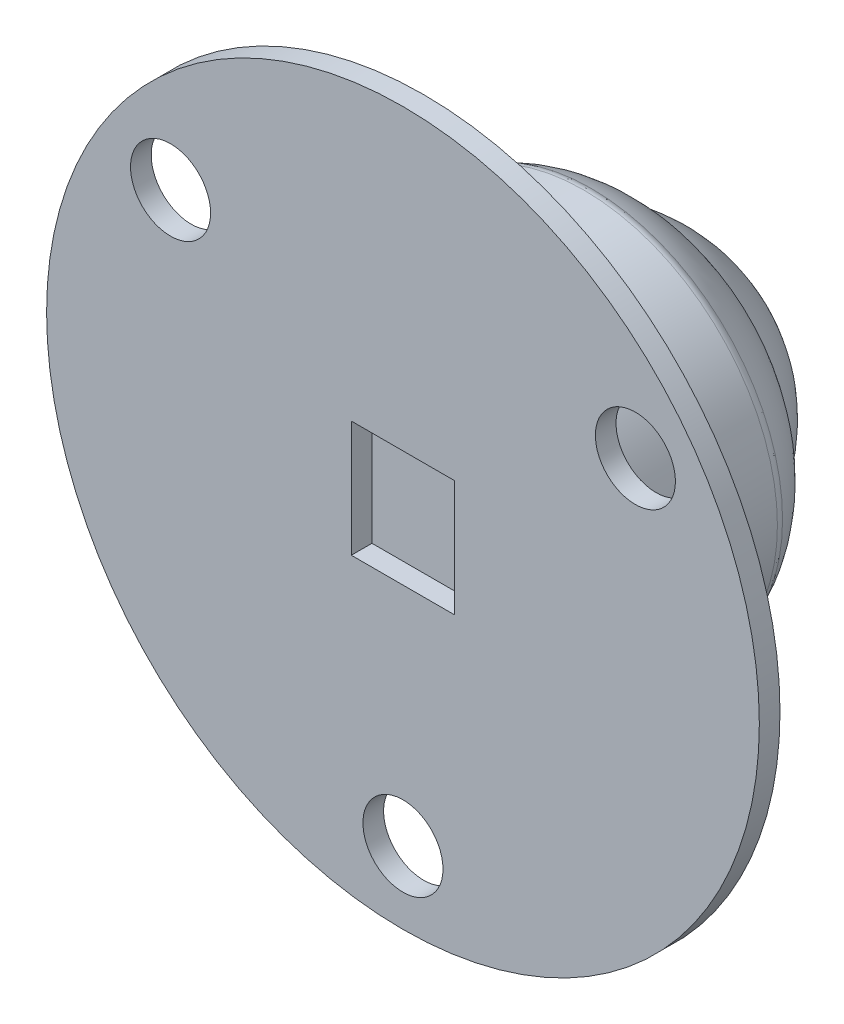
ISO-10303-21;
HEADER;
FILE_DESCRIPTION(('STEP AP214'),'2;1');
FILE_NAME('part.step','',(''),(''),'','','');
FILE_SCHEMA(('AUTOMOTIVE_DESIGN { 1 0 10303 214 1 1 1 1 }'));
ENDSEC;
DATA;
#1=APPLICATION_CONTEXT('core data for automotive mechanical design processes');
#2=APPLICATION_PROTOCOL_DEFINITION('international standard','automotive_design',2000,#1);
#3=PRODUCT_CONTEXT('',#1,'mechanical');
#4=PRODUCT('Part','Part','',(#3));
#5=PRODUCT_RELATED_PRODUCT_CATEGORY('part','',(#4));
#6=PRODUCT_DEFINITION_FORMATION('','',#4);
#7=PRODUCT_DEFINITION_CONTEXT('part definition',#1,'design');
#8=PRODUCT_DEFINITION('design','',#6,#7);
#9=PRODUCT_DEFINITION_SHAPE('','',#8);
#10=(LENGTH_UNIT() NAMED_UNIT(*) SI_UNIT(.MILLI.,.METRE.));
#11=(NAMED_UNIT(*) PLANE_ANGLE_UNIT() SI_UNIT($,.RADIAN.));
#12=(NAMED_UNIT(*) SI_UNIT($,.STERADIAN.) SOLID_ANGLE_UNIT());
#13=UNCERTAINTY_MEASURE_WITH_UNIT(LENGTH_MEASURE(1.E-05),#10,'distance_accuracy_value','');
#14=(GEOMETRIC_REPRESENTATION_CONTEXT(3) GLOBAL_UNCERTAINTY_ASSIGNED_CONTEXT((#13)) GLOBAL_UNIT_ASSIGNED_CONTEXT((#10,
#11,#12)) REPRESENTATION_CONTEXT('',''));
#15=CARTESIAN_POINT('',(0.,0.,0.));
#16=DIRECTION('',(0.,0.,1.));
#17=DIRECTION('',(1.,0.,0.));
#18=AXIS2_PLACEMENT_3D('',#15,#16,#17);
#19=CARTESIAN_POINT('',(0.,0.,0.8));
#20=DIRECTION('',(0.,0.,-1.));
#21=DIRECTION('',(-1.,0.,0.));
#22=AXIS2_PLACEMENT_3D('',#19,#20,#21);
#23=CYLINDRICAL_SURFACE('',#22,13.8);
#24=CARTESIAN_POINT('',(0.,0.,0.8));
#25=DIRECTION('',(0.,0.,1.));
#26=DIRECTION('',(1.,0.,0.));
#27=AXIS2_PLACEMENT_3D('',#24,#25,#26);
#28=CIRCLE('',#27,13.8);
#29=CARTESIAN_POINT('',(13.8,0.,0.8));
#30=VERTEX_POINT('',#29);
#31=EDGE_CURVE('E181',#30,#30,#28,.T.);
#32=ORIENTED_EDGE('',*,*,#31,.F.);
#33=EDGE_LOOP('',(#32));
#34=FACE_BOUND('',#33,.T.);
#35=CARTESIAN_POINT('',(0.,0.,0.));
#36=DIRECTION('',(0.,0.,1.));
#37=DIRECTION('',(1.,0.,0.));
#38=AXIS2_PLACEMENT_3D('',#35,#36,#37);
#39=CIRCLE('',#38,13.8);
#40=CARTESIAN_POINT('',(13.8,0.,0.));
#41=VERTEX_POINT('',#40);
#42=EDGE_CURVE('E179',#41,#41,#39,.T.);
#43=ORIENTED_EDGE('',*,*,#42,.T.);
#44=EDGE_LOOP('',(#43));
#45=FACE_BOUND('',#44,.T.);
#46=ADVANCED_FACE('F33',(#34,#45),#23,.T.);
#47=CARTESIAN_POINT('',(0.,0.,0.8));
#48=DIRECTION('',(0.,0.,1.));
#49=DIRECTION('',(1.,0.,0.));
#50=AXIS2_PLACEMENT_3D('',#47,#48,#49);
#51=PLANE('',#50);
#52=DIRECTION('',(0.,1.,0.));
#53=VECTOR('',#52,1.);
#54=CARTESIAN_POINT('',(2.,-2.25,0.8));
#55=LINE('',#54,#53);
#56=CARTESIAN_POINT('',(2.,-2.25,0.8));
#57=VERTEX_POINT('',#56);
#58=CARTESIAN_POINT('',(2.,2.25,0.8));
#59=VERTEX_POINT('',#58);
#60=EDGE_CURVE('E146',#57,#59,#55,.T.);
#61=ORIENTED_EDGE('',*,*,#60,.F.);
#62=DIRECTION('',(1.,0.,0.));
#63=VECTOR('',#62,1.);
#64=CARTESIAN_POINT('',(-2.,-2.25,0.8));
#65=LINE('',#64,#63);
#66=CARTESIAN_POINT('',(-2.,-2.25,0.8));
#67=VERTEX_POINT('',#66);
#68=EDGE_CURVE('E153',#67,#57,#65,.T.);
#69=ORIENTED_EDGE('',*,*,#68,.F.);
#70=DIRECTION('',(0.,-1.,0.));
#71=VECTOR('',#70,1.);
#72=CARTESIAN_POINT('',(-2.,-2.25,0.8));
#73=LINE('',#72,#71);
#74=CARTESIAN_POINT('',(-2.,2.25,0.8));
#75=VERTEX_POINT('',#74);
#76=EDGE_CURVE('E150',#75,#67,#73,.T.);
#77=ORIENTED_EDGE('',*,*,#76,.F.);
#78=DIRECTION('',(-1.,0.,0.));
#79=VECTOR('',#78,1.);
#80=CARTESIAN_POINT('',(-2.,2.25,0.8));
#81=LINE('',#80,#79);
#82=EDGE_CURVE('E148',#59,#75,#81,.T.);
#83=ORIENTED_EDGE('',*,*,#82,.F.);
#84=EDGE_LOOP('',(#61,#69,#77,#83));
#85=FACE_BOUND('',#84,.T.);
#86=CARTESIAN_POINT('',(0.,-11.,0.8));
#87=DIRECTION('',(0.,0.,1.));
#88=DIRECTION('',(1.,0.,0.));
#89=AXIS2_PLACEMENT_3D('',#86,#87,#88);
#90=CIRCLE('',#89,1.55);
#91=CARTESIAN_POINT('',(1.55,-11.,0.8));
#92=VERTEX_POINT('',#91);
#93=EDGE_CURVE('E164',#92,#92,#90,.F.);
#94=ORIENTED_EDGE('',*,*,#93,.T.);
#95=EDGE_LOOP('',(#94));
#96=FACE_BOUND('',#95,.T.);
#97=CARTESIAN_POINT('',(9.,6.5,0.8));
#98=DIRECTION('',(0.,0.,1.));
#99=DIRECTION('',(1.,0.,0.));
#100=AXIS2_PLACEMENT_3D('',#97,#98,#99);
#101=CIRCLE('',#100,1.55);
#102=CARTESIAN_POINT('',(10.55,6.5,0.8));
#103=VERTEX_POINT('',#102);
#104=EDGE_CURVE('E168',#103,#103,#101,.F.);
#105=ORIENTED_EDGE('',*,*,#104,.T.);
#106=EDGE_LOOP('',(#105));
#107=FACE_BOUND('',#106,.T.);
#108=CARTESIAN_POINT('',(-9.,6.5,0.8));
#109=DIRECTION('',(0.,0.,1.));
#110=DIRECTION('',(1.,0.,0.));
#111=AXIS2_PLACEMENT_3D('',#108,#109,#110);
#112=CIRCLE('',#111,1.55);
#113=CARTESIAN_POINT('',(-7.45,6.5,0.8));
#114=VERTEX_POINT('',#113);
#115=EDGE_CURVE('E172',#114,#114,#112,.F.);
#116=ORIENTED_EDGE('',*,*,#115,.T.);
#117=EDGE_LOOP('',(#116));
#118=FACE_BOUND('',#117,.T.);
#119=ORIENTED_EDGE('',*,*,#31,.T.);
#120=EDGE_LOOP('',(#119));
#121=FACE_BOUND('',#120,.T.);
#122=ADVANCED_FACE('F210',(#85,#96,#107,#118,#121),#51,.T.);
#123=CARTESIAN_POINT('',(0.,0.,0.));
#124=DIRECTION('',(0.,0.,1.));
#125=DIRECTION('',(1.,0.,0.));
#126=AXIS2_PLACEMENT_3D('',#123,#124,#125);
#127=PLANE('',#126);
#128=CARTESIAN_POINT('',(0.,-11.,0.));
#129=DIRECTION('',(0.,0.,1.));
#130=DIRECTION('',(1.,0.,0.));
#131=AXIS2_PLACEMENT_3D('',#128,#129,#130);
#132=CIRCLE('',#131,1.55);
#133=CARTESIAN_POINT('',(1.55,-11.,0.));
#134=VERTEX_POINT('',#133);
#135=EDGE_CURVE('E158',#134,#134,#132,.F.);
#136=ORIENTED_EDGE('',*,*,#135,.F.);
#137=EDGE_LOOP('',(#136));
#138=FACE_BOUND('',#137,.T.);
#139=CARTESIAN_POINT('',(9.,6.5,0.));
#140=DIRECTION('',(0.,0.,1.));
#141=DIRECTION('',(1.,0.,0.));
#142=AXIS2_PLACEMENT_3D('',#139,#140,#141);
#143=CIRCLE('',#142,1.55);
#144=CARTESIAN_POINT('',(10.55,6.5,0.));
#145=VERTEX_POINT('',#144);
#146=EDGE_CURVE('E167',#145,#145,#143,.F.);
#147=ORIENTED_EDGE('',*,*,#146,.F.);
#148=EDGE_LOOP('',(#147));
#149=FACE_BOUND('',#148,.T.);
#150=CARTESIAN_POINT('',(-9.,6.5,0.));
#151=DIRECTION('',(0.,0.,1.));
#152=DIRECTION('',(1.,0.,0.));
#153=AXIS2_PLACEMENT_3D('',#150,#151,#152);
#154=CIRCLE('',#153,1.55);
#155=CARTESIAN_POINT('',(-7.45,6.5,0.));
#156=VERTEX_POINT('',#155);
#157=EDGE_CURVE('E171',#156,#156,#154,.F.);
#158=ORIENTED_EDGE('',*,*,#157,.F.);
#159=EDGE_LOOP('',(#158));
#160=FACE_BOUND('',#159,.T.);
#161=CARTESIAN_POINT('',(0.,0.,0.));
#162=DIRECTION('',(0.,0.,1.));
#163=DIRECTION('',(1.,0.,0.));
#164=AXIS2_PLACEMENT_3D('',#161,#162,#163);
#165=CIRCLE('',#164,8.);
#166=CARTESIAN_POINT('',(8.,0.,0.));
#167=VERTEX_POINT('',#166);
#168=EDGE_CURVE('E41',#167,#167,#165,.T.);
#169=ORIENTED_EDGE('',*,*,#168,.T.);
#170=EDGE_LOOP('',(#169));
#171=FACE_BOUND('',#170,.T.);
#172=ORIENTED_EDGE('',*,*,#42,.F.);
#173=EDGE_LOOP('',(#172));
#174=FACE_BOUND('',#173,.T.);
#175=ADVANCED_FACE('F206',(#138,#149,#160,#171,#174),#127,.F.);
#176=CARTESIAN_POINT('',(0.,0.,-6.5));
#177=DIRECTION('',(0.,0.,1.));
#178=DIRECTION('',(1.,0.,0.));
#179=AXIS2_PLACEMENT_3D('',#176,#177,#178);
#180=CYLINDRICAL_SURFACE('',#179,7.5);
#181=CARTESIAN_POINT('',(0.,0.,-0.5));
#182=DIRECTION('',(0.,0.,1.));
#183=DIRECTION('',(1.,0.,0.));
#184=AXIS2_PLACEMENT_3D('',#181,#182,#183);
#185=CIRCLE('',#184,7.5);
#186=CARTESIAN_POINT('',(7.5,0.,-0.5));
#187=VERTEX_POINT('',#186);
#188=EDGE_CURVE('E191',#187,#187,#185,.F.);
#189=CARTESIAN_POINT('',(0.,0.,-6.2));
#190=DIRECTION('',(0.,0.,-1.));
#191=DIRECTION('',(-1.,0.,0.));
#192=AXIS2_PLACEMENT_3D('',#189,#190,#191);
#193=CIRCLE('',#192,7.5);
#194=CARTESIAN_POINT('',(7.5,0.,-6.2));
#195=VERTEX_POINT('',#194);
#196=EDGE_CURVE('E184',#195,#195,#193,.F.);
#197=CARTESIAN_POINT('',(7.5,0.,-0.5));
#198=CARTESIAN_POINT('',(7.5,0.,-0.559375000000001));
#199=CARTESIAN_POINT('',(7.5,0.,-0.618750000000001));
#200=CARTESIAN_POINT('',(7.5,0.,-0.737500000000001));
#201=CARTESIAN_POINT('',(7.5,0.,-0.796875000000001));
#202=CARTESIAN_POINT('',(7.5,0.,-0.915625000000001));
#203=CARTESIAN_POINT('',(7.5,0.,-0.975000000000001));
#204=CARTESIAN_POINT('',(7.5,0.,-1.09375));
#205=CARTESIAN_POINT('',(7.5,0.,-1.153125));
#206=CARTESIAN_POINT('',(7.5,0.,-1.271875));
#207=CARTESIAN_POINT('',(7.5,0.,-1.33125));
#208=CARTESIAN_POINT('',(7.5,0.,-1.45));
#209=CARTESIAN_POINT('',(7.5,0.,-1.509375));
#210=CARTESIAN_POINT('',(7.5,0.,-1.628125));
#211=CARTESIAN_POINT('',(7.5,0.,-1.6875));
#212=CARTESIAN_POINT('',(7.5,0.,-1.80625));
#213=CARTESIAN_POINT('',(7.5,0.,-1.865625));
#214=CARTESIAN_POINT('',(7.5,0.,-1.984375));
#215=CARTESIAN_POINT('',(7.5,0.,-2.04375));
#216=CARTESIAN_POINT('',(7.5,0.,-2.1625));
#217=CARTESIAN_POINT('',(7.5,0.,-2.221875));
#218=CARTESIAN_POINT('',(7.5,0.,-2.340625));
#219=CARTESIAN_POINT('',(7.5,0.,-2.4));
#220=CARTESIAN_POINT('',(7.5,0.,-2.51875));
#221=CARTESIAN_POINT('',(7.5,0.,-2.578125));
#222=CARTESIAN_POINT('',(7.5,0.,-2.696875));
#223=CARTESIAN_POINT('',(7.5,0.,-2.75625));
#224=CARTESIAN_POINT('',(7.5,0.,-2.875));
#225=CARTESIAN_POINT('',(7.5,0.,-2.934375));
#226=CARTESIAN_POINT('',(7.5,0.,-3.053125));
#227=CARTESIAN_POINT('',(7.5,0.,-3.1125));
#228=CARTESIAN_POINT('',(7.5,0.,-3.23125));
#229=CARTESIAN_POINT('',(7.5,0.,-3.290625));
#230=CARTESIAN_POINT('',(7.5,0.,-3.409375));
#231=CARTESIAN_POINT('',(7.5,0.,-3.46875));
#232=CARTESIAN_POINT('',(7.5,0.,-3.5875));
#233=CARTESIAN_POINT('',(7.5,0.,-3.646875));
#234=CARTESIAN_POINT('',(7.5,0.,-3.765625));
#235=CARTESIAN_POINT('',(7.5,0.,-3.825));
#236=CARTESIAN_POINT('',(7.5,0.,-3.94375));
#237=CARTESIAN_POINT('',(7.5,0.,-4.003125));
#238=CARTESIAN_POINT('',(7.5,0.,-4.121875));
#239=CARTESIAN_POINT('',(7.5,0.,-4.18125));
#240=CARTESIAN_POINT('',(7.5,0.,-4.3));
#241=CARTESIAN_POINT('',(7.5,0.,-4.359375));
#242=CARTESIAN_POINT('',(7.5,0.,-4.478125));
#243=CARTESIAN_POINT('',(7.5,0.,-4.5375));
#244=CARTESIAN_POINT('',(7.5,0.,-4.65625));
#245=CARTESIAN_POINT('',(7.5,0.,-4.715625));
#246=CARTESIAN_POINT('',(7.5,0.,-4.834375));
#247=CARTESIAN_POINT('',(7.5,0.,-4.89375));
#248=CARTESIAN_POINT('',(7.5,0.,-5.0125));
#249=CARTESIAN_POINT('',(7.5,0.,-5.071875));
#250=CARTESIAN_POINT('',(7.5,0.,-5.190625));
#251=CARTESIAN_POINT('',(7.5,0.,-5.25));
#252=CARTESIAN_POINT('',(7.5,0.,-5.36875));
#253=CARTESIAN_POINT('',(7.5,0.,-5.428125));
#254=CARTESIAN_POINT('',(7.5,0.,-5.546875));
#255=CARTESIAN_POINT('',(7.5,0.,-5.60625));
#256=CARTESIAN_POINT('',(7.5,0.,-5.725));
#257=CARTESIAN_POINT('',(7.5,0.,-5.784375));
#258=CARTESIAN_POINT('',(7.5,0.,-5.903125));
#259=CARTESIAN_POINT('',(7.5,0.,-5.9625));
#260=CARTESIAN_POINT('',(7.5,0.,-6.08125));
#261=CARTESIAN_POINT('',(7.5,0.,-6.140625));
#262=CARTESIAN_POINT('',(7.5,0.,-6.2));
#263=B_SPLINE_CURVE_WITH_KNOTS('',3,(#197,#198,#199,#200,#201,#202,#203,#204,#205,#206,#207,
#208,#209,#210,#211,#212,#213,#214,#215,#216,#217,#218,#219,#220,#221,#222,#223,#224,#225,#226,
#227,#228,#229,#230,#231,#232,#233,#234,#235,#236,#237,#238,#239,#240,#241,#242,#243,#244,#245,
#246,#247,#248,#249,#250,#251,#252,#253,#254,#255,#256,#257,#258,#259,#260,#261,#262),
.UNSPECIFIED.,.F.,.F.,(4,2,2,2,2,2,2,2,2,2,2,2,2,2,2,2,2,2,2,2,2,2,2,2,2,2,2,2,2,2,2,2,4),(0.,
0.178125,0.356250000000001,0.534375,0.7125,0.890625000000001,1.06875,1.246875,1.425,1.603125,
1.78125,1.959375,2.1375,2.315625,2.49375,2.671875,2.85,3.028125,3.20625,3.384375,3.5625,
3.740625,3.91875,4.096875,4.275,4.453125,4.63125,4.809375,4.9875,5.165625,5.34375,5.521875,5.7),.UNSPECIFIED.);
#264=EDGE_CURVE('BSEAM209',#187,#195,#263,.T.);
#265=ORIENTED_EDGE('',*,*,#188,.T.);
#266=ORIENTED_EDGE('',*,*,#196,.T.);
#267=ORIENTED_EDGE('',*,*,#264,.T.);
#268=ORIENTED_EDGE('',*,*,#264,.F.);
#269=EDGE_LOOP('',(#265,#267,#266,#268));
#270=FACE_BOUND('',#269,.T.);
#271=ADVANCED_FACE('F209',(#270),#180,.T.);
#272=CARTESIAN_POINT('',(0.,0.,-4.5));
#273=DIRECTION('',(0.,0.,1.));
#274=DIRECTION('',(1.,0.,0.));
#275=AXIS2_PLACEMENT_3D('',#272,#273,#274);
#276=DEGENERATE_TOROIDAL_SURFACE('',#275,2.81742430504416,5.,.T.);
#277=CARTESIAN_POINT('',(0.,0.,-8.6202566585524));
#278=DIRECTION('',(0.,0.,1.));
#279=DIRECTION('',(1.,0.,0.));
#280=AXIS2_PLACEMENT_3D('',#277,#278,#279);
#281=CIRCLE('',#280,5.65);
#282=CARTESIAN_POINT('',(5.65,0.,-8.6202566585524));
#283=VERTEX_POINT('',#282);
#284=EDGE_CURVE('E180',#283,#283,#281,.F.);
#285=ORIENTED_EDGE('',*,*,#284,.F.);
#286=EDGE_LOOP('',(#285));
#287=FACE_BOUND('',#286,.T.);
#288=CARTESIAN_POINT('',(0.,0.,-6.5));
#289=DIRECTION('',(0.,0.,-1.));
#290=DIRECTION('',(-1.,0.,0.));
#291=AXIS2_PLACEMENT_3D('',#288,#289,#290);
#292=CIRCLE('',#291,7.4);
#293=CARTESIAN_POINT('',(-7.4,0.,-6.5));
#294=VERTEX_POINT('',#293);
#295=EDGE_CURVE('E176',#294,#294,#292,.T.);
#296=ORIENTED_EDGE('',*,*,#295,.T.);
#297=EDGE_LOOP('',(#296));
#298=FACE_BOUND('',#297,.T.);
#299=ADVANCED_FACE('F230',(#287,#298),#276,.T.);
#300=CARTESIAN_POINT('',(0.,0.,-3.5));
#301=DIRECTION('',(0.,0.,-1.));
#302=DIRECTION('',(-1.,0.,0.));
#303=AXIS2_PLACEMENT_3D('',#300,#301,#302);
#304=CYLINDRICAL_SURFACE('',#303,5.65);
#305=ORIENTED_EDGE('',*,*,#284,.T.);
#306=EDGE_LOOP('',(#305));
#307=FACE_BOUND('',#306,.T.);
#308=CARTESIAN_POINT('',(0.,0.,-3.5));
#309=DIRECTION('',(0.,0.,-1.));
#310=DIRECTION('',(-1.,0.,0.));
#311=AXIS2_PLACEMENT_3D('',#308,#309,#310);
#312=CIRCLE('',#311,5.65);
#313=CARTESIAN_POINT('',(-5.65,0.,-3.5));
#314=VERTEX_POINT('',#313);
#315=EDGE_CURVE('E175',#314,#314,#312,.T.);
#316=ORIENTED_EDGE('',*,*,#315,.F.);
#317=EDGE_LOOP('',(#316));
#318=FACE_BOUND('',#317,.T.);
#319=ADVANCED_FACE('F233',(#307,#318),#304,.F.);
#320=CARTESIAN_POINT('',(0.,0.,-5.83609467455621));
#321=DIRECTION('',(0.,0.,1.));
#322=DIRECTION('',(1.,0.,0.));
#323=AXIS2_PLACEMENT_3D('',#320,#321,#322);
#324=SPHERICAL_SURFACE('',#323,6.11390532544379);
#325=ORIENTED_EDGE('',*,*,#315,.T.);
#326=EDGE_LOOP('',(#325));
#327=FACE_BOUND('',#326,.T.);
#328=ADVANCED_FACE('F35',(#327),#324,.T.);
#329=CARTESIAN_POINT('',(0.,0.,-0.5));
#330=DIRECTION('',(0.,0.,1.));
#331=DIRECTION('',(1.,0.,0.));
#332=AXIS2_PLACEMENT_3D('',#329,#330,#331);
#333=TOROIDAL_SURFACE('',#332,8.,0.5);
#334=ORIENTED_EDGE('',*,*,#168,.F.);
#335=EDGE_LOOP('',(#334));
#336=FACE_BOUND('',#335,.T.);
#337=ORIENTED_EDGE('',*,*,#188,.F.);
#338=EDGE_LOOP('',(#337));
#339=FACE_BOUND('',#338,.T.);
#340=ADVANCED_FACE('F235',(#336,#339),#333,.F.);
#341=CARTESIAN_POINT('',(0.,0.,-6.2));
#342=DIRECTION('',(0.,0.,-1.));
#343=DIRECTION('',(-1.,0.,0.));
#344=AXIS2_PLACEMENT_3D('',#341,#342,#343);
#345=TOROIDAL_SURFACE('',#344,7.,0.5);
#346=ORIENTED_EDGE('',*,*,#196,.F.);
#347=EDGE_LOOP('',(#346));
#348=FACE_BOUND('',#347,.T.);
#349=ORIENTED_EDGE('',*,*,#295,.F.);
#350=EDGE_LOOP('',(#349));
#351=FACE_BOUND('',#350,.T.);
#352=ADVANCED_FACE('F237',(#348,#351),#345,.T.);
#353=CARTESIAN_POINT('',(-9.,6.5,-6.));
#354=DIRECTION('',(0.,0.,1.));
#355=DIRECTION('',(1.,0.,0.));
#356=AXIS2_PLACEMENT_3D('',#353,#354,#355);
#357=CYLINDRICAL_SURFACE('',#356,1.55);
#358=ORIENTED_EDGE('',*,*,#115,.F.);
#359=EDGE_LOOP('',(#358));
#360=FACE_BOUND('',#359,.T.);
#361=ORIENTED_EDGE('',*,*,#157,.T.);
#362=EDGE_LOOP('',(#361));
#363=FACE_BOUND('',#362,.T.);
#364=ADVANCED_FACE('F240',(#360,#363),#357,.F.);
#365=CARTESIAN_POINT('',(9.,6.5,-6.));
#366=DIRECTION('',(0.,0.,1.));
#367=DIRECTION('',(1.,0.,0.));
#368=AXIS2_PLACEMENT_3D('',#365,#366,#367);
#369=CYLINDRICAL_SURFACE('',#368,1.55);
#370=ORIENTED_EDGE('',*,*,#104,.F.);
#371=EDGE_LOOP('',(#370));
#372=FACE_BOUND('',#371,.T.);
#373=ORIENTED_EDGE('',*,*,#146,.T.);
#374=EDGE_LOOP('',(#373));
#375=FACE_BOUND('',#374,.T.);
#376=ADVANCED_FACE('F245',(#372,#375),#369,.F.);
#377=CARTESIAN_POINT('',(0.,-11.,-6.));
#378=DIRECTION('',(0.,0.,1.));
#379=DIRECTION('',(1.,0.,0.));
#380=AXIS2_PLACEMENT_3D('',#377,#378,#379);
#381=CYLINDRICAL_SURFACE('',#380,1.55);
#382=ORIENTED_EDGE('',*,*,#93,.F.);
#383=EDGE_LOOP('',(#382));
#384=FACE_BOUND('',#383,.T.);
#385=ORIENTED_EDGE('',*,*,#135,.T.);
#386=EDGE_LOOP('',(#385));
#387=FACE_BOUND('',#386,.T.);
#388=ADVANCED_FACE('F204',(#384,#387),#381,.F.);
#389=CARTESIAN_POINT('',(2.,-2.25,-0.2));
#390=DIRECTION('',(1.,0.,0.));
#391=DIRECTION('',(0.,0.,-1.));
#392=AXIS2_PLACEMENT_3D('',#389,#390,#391);
#393=PLANE('',#392);
#394=DIRECTION('',(0.,0.,1.));
#395=VECTOR('',#394,1.);
#396=CARTESIAN_POINT('',(2.,2.25,-0.2));
#397=LINE('',#396,#395);
#398=CARTESIAN_POINT('',(2.,2.25,0.));
#399=VERTEX_POINT('',#398);
#400=EDGE_CURVE('E54',#399,#59,#397,.T.);
#401=ORIENTED_EDGE('',*,*,#400,.F.);
#402=DIRECTION('',(0.,-1.,0.));
#403=VECTOR('',#402,1.);
#404=CARTESIAN_POINT('',(2.,-2.25,0.));
#405=LINE('',#404,#403);
#406=CARTESIAN_POINT('',(2.,-2.25,0.));
#407=VERTEX_POINT('',#406);
#408=EDGE_CURVE('E48',#399,#407,#405,.T.);
#409=ORIENTED_EDGE('',*,*,#408,.T.);
#410=DIRECTION('',(0.,0.,1.));
#411=VECTOR('',#410,1.);
#412=CARTESIAN_POINT('',(2.,-2.25,-0.2));
#413=LINE('',#412,#411);
#414=EDGE_CURVE('E156',#407,#57,#413,.T.);
#415=ORIENTED_EDGE('',*,*,#414,.T.);
#416=ORIENTED_EDGE('',*,*,#60,.T.);
#417=EDGE_LOOP('',(#401,#409,#415,#416));
#418=FACE_BOUND('',#417,.T.);
#419=ADVANCED_FACE('F267',(#418),#393,.F.);
#420=CARTESIAN_POINT('',(-2.,-2.25,-0.2));
#421=DIRECTION('',(0.,-1.,0.));
#422=DIRECTION('',(0.,0.,-1.));
#423=AXIS2_PLACEMENT_3D('',#420,#421,#422);
#424=PLANE('',#423);
#425=ORIENTED_EDGE('',*,*,#414,.F.);
#426=DIRECTION('',(-1.,0.,0.));
#427=VECTOR('',#426,1.);
#428=CARTESIAN_POINT('',(-2.,-2.25,0.));
#429=LINE('',#428,#427);
#430=CARTESIAN_POINT('',(-2.,-2.25,0.));
#431=VERTEX_POINT('',#430);
#432=EDGE_CURVE('E142',#407,#431,#429,.T.);
#433=ORIENTED_EDGE('',*,*,#432,.T.);
#434=DIRECTION('',(0.,0.,1.));
#435=VECTOR('',#434,1.);
#436=CARTESIAN_POINT('',(-2.,-2.25,-0.2));
#437=LINE('',#436,#435);
#438=EDGE_CURVE('E159',#431,#67,#437,.T.);
#439=ORIENTED_EDGE('',*,*,#438,.T.);
#440=ORIENTED_EDGE('',*,*,#68,.T.);
#441=EDGE_LOOP('',(#425,#433,#439,#440));
#442=FACE_BOUND('',#441,.T.);
#443=ADVANCED_FACE('F271',(#442),#424,.F.);
#444=CARTESIAN_POINT('',(-2.,-2.25,-0.2));
#445=DIRECTION('',(-1.,0.,0.));
#446=DIRECTION('',(0.,0.,1.));
#447=AXIS2_PLACEMENT_3D('',#444,#445,#446);
#448=PLANE('',#447);
#449=ORIENTED_EDGE('',*,*,#438,.F.);
#450=DIRECTION('',(0.,1.,0.));
#451=VECTOR('',#450,1.);
#452=CARTESIAN_POINT('',(-2.,-2.25,0.));
#453=LINE('',#452,#451);
#454=CARTESIAN_POINT('',(-2.,2.25,0.));
#455=VERTEX_POINT('',#454);
#456=EDGE_CURVE('E109',#431,#455,#453,.T.);
#457=ORIENTED_EDGE('',*,*,#456,.T.);
#458=DIRECTION('',(0.,0.,1.));
#459=VECTOR('',#458,1.);
#460=CARTESIAN_POINT('',(-2.,2.25,-0.2));
#461=LINE('',#460,#459);
#462=EDGE_CURVE('E161',#455,#75,#461,.T.);
#463=ORIENTED_EDGE('',*,*,#462,.T.);
#464=ORIENTED_EDGE('',*,*,#76,.T.);
#465=EDGE_LOOP('',(#449,#457,#463,#464));
#466=FACE_BOUND('',#465,.T.);
#467=ADVANCED_FACE('F277',(#466),#448,.F.);
#468=CARTESIAN_POINT('',(-2.,2.25,-0.2));
#469=DIRECTION('',(0.,1.,0.));
#470=DIRECTION('',(0.,0.,1.));
#471=AXIS2_PLACEMENT_3D('',#468,#469,#470);
#472=PLANE('',#471);
#473=ORIENTED_EDGE('',*,*,#462,.F.);
#474=DIRECTION('',(1.,0.,0.));
#475=VECTOR('',#474,1.);
#476=CARTESIAN_POINT('',(-2.,2.25,0.));
#477=LINE('',#476,#475);
#478=EDGE_CURVE('E11',#455,#399,#477,.T.);
#479=ORIENTED_EDGE('',*,*,#478,.T.);
#480=ORIENTED_EDGE('',*,*,#400,.T.);
#481=ORIENTED_EDGE('',*,*,#82,.T.);
#482=EDGE_LOOP('',(#473,#479,#480,#481));
#483=FACE_BOUND('',#482,.T.);
#484=ADVANCED_FACE('F273',(#483),#472,.F.);
#485=CARTESIAN_POINT('',(3.,-3.,0.));
#486=DIRECTION('',(0.,0.,1.));
#487=DIRECTION('',(1.,0.,0.));
#488=AXIS2_PLACEMENT_3D('',#485,#486,#487);
#489=PLANE('',#488);
#490=DIRECTION('',(0.,1.,0.));
#491=VECTOR('',#490,1.);
#492=CARTESIAN_POINT('',(3.,3.,0.));
#493=LINE('',#492,#491);
#494=CARTESIAN_POINT('',(3.,-3.,0.));
#495=VERTEX_POINT('',#494);
#496=CARTESIAN_POINT('',(3.,3.,0.));
#497=VERTEX_POINT('',#496);
#498=EDGE_CURVE('E107',#495,#497,#493,.T.);
#499=ORIENTED_EDGE('',*,*,#498,.F.);
#500=DIRECTION('',(1.,0.,0.));
#501=VECTOR('',#500,1.);
#502=CARTESIAN_POINT('',(-3.,-3.,0.));
#503=LINE('',#502,#501);
#504=CARTESIAN_POINT('',(-3.,-3.,0.));
#505=VERTEX_POINT('',#504);
#506=EDGE_CURVE('E133',#505,#495,#503,.T.);
#507=ORIENTED_EDGE('',*,*,#506,.F.);
#508=DIRECTION('',(0.,-1.,0.));
#509=VECTOR('',#508,1.);
#510=CARTESIAN_POINT('',(-3.,3.,0.));
#511=LINE('',#510,#509);
#512=CARTESIAN_POINT('',(-3.,3.,0.));
#513=VERTEX_POINT('',#512);
#514=EDGE_CURVE('E131',#513,#505,#511,.T.);
#515=ORIENTED_EDGE('',*,*,#514,.F.);
#516=DIRECTION('',(-1.,0.,0.));
#517=VECTOR('',#516,1.);
#518=CARTESIAN_POINT('',(-3.,3.,0.));
#519=LINE('',#518,#517);
#520=EDGE_CURVE('E129',#497,#513,#519,.T.);
#521=ORIENTED_EDGE('',*,*,#520,.F.);
#522=EDGE_LOOP('',(#499,#507,#515,#521));
#523=FACE_BOUND('',#522,.T.);
#524=ORIENTED_EDGE('',*,*,#478,.F.);
#525=ORIENTED_EDGE('',*,*,#456,.F.);
#526=ORIENTED_EDGE('',*,*,#432,.F.);
#527=ORIENTED_EDGE('',*,*,#408,.F.);
#528=EDGE_LOOP('',(#524,#525,#526,#527));
#529=FACE_BOUND('',#528,.T.);
#530=ADVANCED_FACE('F276',(#523,#529),#489,.F.);
#531=CARTESIAN_POINT('',(3.,3.,0.));
#532=DIRECTION('',(-1.,0.,0.));
#533=DIRECTION('',(0.,0.,1.));
#534=AXIS2_PLACEMENT_3D('',#531,#532,#533);
#535=PLANE('',#534);
#536=DIRECTION('',(0.,0.,-1.));
#537=VECTOR('',#536,1.);
#538=CARTESIAN_POINT('',(3.,-3.,0.));
#539=LINE('',#538,#537);
#540=CARTESIAN_POINT('',(3.,-3.,-0.7));
#541=VERTEX_POINT('',#540);
#542=EDGE_CURVE('E135',#495,#541,#539,.T.);
#543=ORIENTED_EDGE('',*,*,#542,.F.);
#544=ORIENTED_EDGE('',*,*,#498,.T.);
#545=DIRECTION('',(0.,0.,-1.));
#546=VECTOR('',#545,1.);
#547=CARTESIAN_POINT('',(3.,3.,0.));
#548=LINE('',#547,#546);
#549=CARTESIAN_POINT('',(3.,3.,-0.7));
#550=VERTEX_POINT('',#549);
#551=EDGE_CURVE('E99',#497,#550,#548,.T.);
#552=ORIENTED_EDGE('',*,*,#551,.T.);
#553=DIRECTION('',(0.,1.,0.));
#554=VECTOR('',#553,1.);
#555=CARTESIAN_POINT('',(3.,3.,-0.7));
#556=LINE('',#555,#554);
#557=EDGE_CURVE('E104',#541,#550,#556,.T.);
#558=ORIENTED_EDGE('',*,*,#557,.F.);
#559=EDGE_LOOP('',(#543,#544,#552,#558));
#560=FACE_BOUND('',#559,.T.);
#561=ADVANCED_FACE('F102',(#560),#535,.T.);
#562=CARTESIAN_POINT('',(-3.,3.,0.));
#563=DIRECTION('',(0.,-1.,0.));
#564=DIRECTION('',(0.,0.,-1.));
#565=AXIS2_PLACEMENT_3D('',#562,#563,#564);
#566=PLANE('',#565);
#567=ORIENTED_EDGE('',*,*,#551,.F.);
#568=ORIENTED_EDGE('',*,*,#520,.T.);
#569=DIRECTION('',(0.,0.,-1.));
#570=VECTOR('',#569,1.);
#571=CARTESIAN_POINT('',(-3.,3.,0.));
#572=LINE('',#571,#570);
#573=CARTESIAN_POINT('',(-3.,3.,-0.7));
#574=VERTEX_POINT('',#573);
#575=EDGE_CURVE('E110',#513,#574,#572,.T.);
#576=ORIENTED_EDGE('',*,*,#575,.T.);
#577=DIRECTION('',(-1.,0.,0.));
#578=VECTOR('',#577,1.);
#579=CARTESIAN_POINT('',(-3.,3.,-0.7));
#580=LINE('',#579,#578);
#581=EDGE_CURVE('E113',#550,#574,#580,.T.);
#582=ORIENTED_EDGE('',*,*,#581,.F.);
#583=EDGE_LOOP('',(#567,#568,#576,#582));
#584=FACE_BOUND('',#583,.T.);
#585=ADVANCED_FACE('F114',(#584),#566,.T.);
#586=CARTESIAN_POINT('',(-3.,3.,0.));
#587=DIRECTION('',(1.,0.,0.));
#588=DIRECTION('',(0.,1.,0.));
#589=AXIS2_PLACEMENT_3D('',#586,#587,#588);
#590=PLANE('',#589);
#591=ORIENTED_EDGE('',*,*,#575,.F.);
#592=ORIENTED_EDGE('',*,*,#514,.T.);
#593=DIRECTION('',(0.,0.,-1.));
#594=VECTOR('',#593,1.);
#595=CARTESIAN_POINT('',(-3.,-3.,0.));
#596=LINE('',#595,#594);
#597=CARTESIAN_POINT('',(-3.,-3.,-0.7));
#598=VERTEX_POINT('',#597);
#599=EDGE_CURVE('E137',#505,#598,#596,.T.);
#600=ORIENTED_EDGE('',*,*,#599,.T.);
#601=DIRECTION('',(0.,-1.,0.));
#602=VECTOR('',#601,1.);
#603=CARTESIAN_POINT('',(-3.,3.,-0.7));
#604=LINE('',#603,#602);
#605=EDGE_CURVE('E119',#574,#598,#604,.T.);
#606=ORIENTED_EDGE('',*,*,#605,.F.);
#607=EDGE_LOOP('',(#591,#592,#600,#606));
#608=FACE_BOUND('',#607,.T.);
#609=ADVANCED_FACE('F288',(#608),#590,.T.);
#610=CARTESIAN_POINT('',(-3.,-3.,0.));
#611=DIRECTION('',(0.,1.,0.));
#612=DIRECTION('',(0.,0.,1.));
#613=AXIS2_PLACEMENT_3D('',#610,#611,#612);
#614=PLANE('',#613);
#615=ORIENTED_EDGE('',*,*,#599,.F.);
#616=ORIENTED_EDGE('',*,*,#506,.T.);
#617=ORIENTED_EDGE('',*,*,#542,.T.);
#618=DIRECTION('',(1.,0.,0.));
#619=VECTOR('',#618,1.);
#620=CARTESIAN_POINT('',(-3.,-3.,-0.7));
#621=LINE('',#620,#619);
#622=EDGE_CURVE('E123',#598,#541,#621,.T.);
#623=ORIENTED_EDGE('',*,*,#622,.F.);
#624=EDGE_LOOP('',(#615,#616,#617,#623));
#625=FACE_BOUND('',#624,.T.);
#626=ADVANCED_FACE('F291',(#625),#614,.T.);
#627=CARTESIAN_POINT('',(3.,-3.,-0.7));
#628=DIRECTION('',(0.,0.,1.));
#629=DIRECTION('',(1.,0.,0.));
#630=AXIS2_PLACEMENT_3D('',#627,#628,#629);
#631=PLANE('',#630);
#632=ORIENTED_EDGE('',*,*,#557,.T.);
#633=ORIENTED_EDGE('',*,*,#581,.T.);
#634=ORIENTED_EDGE('',*,*,#605,.T.);
#635=ORIENTED_EDGE('',*,*,#622,.T.);
#636=EDGE_LOOP('',(#632,#633,#634,#635));
#637=FACE_BOUND('',#636,.T.);
#638=ADVANCED_FACE('F121',(#637),#631,.T.);
#639=CLOSED_SHELL('',(#46,#122,#175,#271,#299,#319,#328,#340,#352,#364,#376,#388,#419,#443,#467,
#484,#530,#561,#585,#609,#626,#638));
#640=MANIFOLD_SOLID_BREP('B2',#639);
#641=ADVANCED_BREP_SHAPE_REPRESENTATION('',(#18,#640),#14);
#642=SHAPE_DEFINITION_REPRESENTATION(#9,#641);
ENDSEC;
END-ISO-10303-21;
